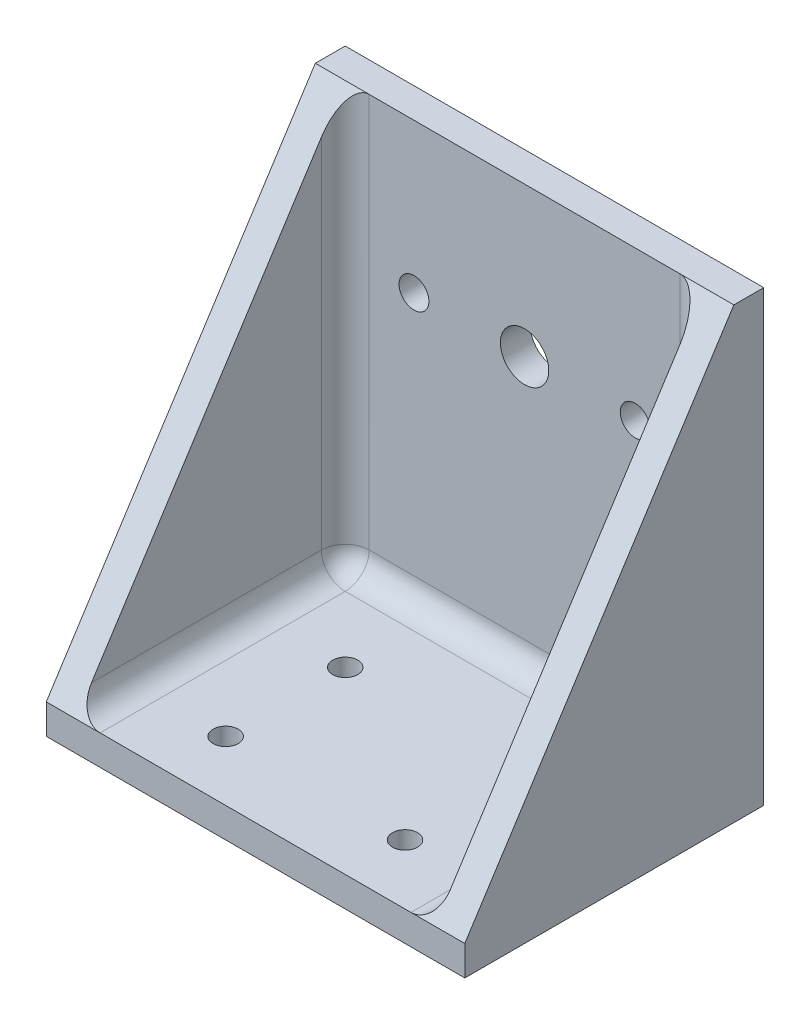
ISO-10303-21;
HEADER;
FILE_DESCRIPTION(('STEP AP214'),'2;1');
FILE_NAME('part.step','',(''),(''),'','','');
FILE_SCHEMA(('AUTOMOTIVE_DESIGN { 1 0 10303 214 1 1 1 1 }'));
ENDSEC;
DATA;
#1=APPLICATION_CONTEXT('core data for automotive mechanical design processes');
#2=APPLICATION_PROTOCOL_DEFINITION('international standard','automotive_design',2000,#1);
#3=PRODUCT_CONTEXT('',#1,'mechanical');
#4=PRODUCT('Part','Part','',(#3));
#5=PRODUCT_RELATED_PRODUCT_CATEGORY('part','',(#4));
#6=PRODUCT_DEFINITION_FORMATION('','',#4);
#7=PRODUCT_DEFINITION_CONTEXT('part definition',#1,'design');
#8=PRODUCT_DEFINITION('design','',#6,#7);
#9=PRODUCT_DEFINITION_SHAPE('','',#8);
#10=(LENGTH_UNIT() NAMED_UNIT(*) SI_UNIT(.MILLI.,.METRE.));
#11=(NAMED_UNIT(*) PLANE_ANGLE_UNIT() SI_UNIT($,.RADIAN.));
#12=(NAMED_UNIT(*) SI_UNIT($,.STERADIAN.) SOLID_ANGLE_UNIT());
#13=UNCERTAINTY_MEASURE_WITH_UNIT(LENGTH_MEASURE(1.E-05),#10,'distance_accuracy_value','');
#14=(GEOMETRIC_REPRESENTATION_CONTEXT(3) GLOBAL_UNCERTAINTY_ASSIGNED_CONTEXT((#13)) GLOBAL_UNIT_ASSIGNED_CONTEXT((#10,
#11,#12)) REPRESENTATION_CONTEXT('',''));
#15=CARTESIAN_POINT('',(0.,0.,0.));
#16=DIRECTION('',(0.,0.,1.));
#17=DIRECTION('',(1.,0.,0.));
#18=AXIS2_PLACEMENT_3D('',#15,#16,#17);
#19=CARTESIAN_POINT('',(0.,5.,0.));
#20=DIRECTION('',(0.,-1.,0.));
#21=DIRECTION('',(0.,0.,-1.));
#22=AXIS2_PLACEMENT_3D('',#19,#20,#21);
#23=PLANE('',#22);
#24=CARTESIAN_POINT('',(-15.,5.,15.));
#25=DIRECTION('',(0.,1.,0.));
#26=DIRECTION('',(0.,0.,1.));
#27=AXIS2_PLACEMENT_3D('',#24,#25,#26);
#28=CIRCLE('',#27,2.1);
#29=CARTESIAN_POINT('',(-15.,5.,17.1));
#30=VERTEX_POINT('',#29);
#31=EDGE_CURVE('E460',#30,#30,#28,.T.);
#32=ORIENTED_EDGE('',*,*,#31,.F.);
#33=EDGE_LOOP('',(#32));
#34=FACE_BOUND('',#33,.T.);
#35=CARTESIAN_POINT('',(15.,5.,15.));
#36=DIRECTION('',(0.,1.,0.));
#37=DIRECTION('',(0.,0.,1.));
#38=AXIS2_PLACEMENT_3D('',#35,#36,#37);
#39=CIRCLE('',#38,2.1);
#40=CARTESIAN_POINT('',(15.,5.,17.1));
#41=VERTEX_POINT('',#40);
#42=EDGE_CURVE('E450',#41,#41,#39,.T.);
#43=ORIENTED_EDGE('',*,*,#42,.F.);
#44=EDGE_LOOP('',(#43));
#45=FACE_BOUND('',#44,.T.);
#46=CARTESIAN_POINT('',(15.,5.,-5.));
#47=DIRECTION('',(0.,1.,0.));
#48=DIRECTION('',(0.,0.,1.));
#49=AXIS2_PLACEMENT_3D('',#46,#47,#48);
#50=CIRCLE('',#49,2.1);
#51=CARTESIAN_POINT('',(15.,5.,-2.9));
#52=VERTEX_POINT('',#51);
#53=EDGE_CURVE('E442',#52,#52,#50,.T.);
#54=ORIENTED_EDGE('',*,*,#53,.F.);
#55=EDGE_LOOP('',(#54));
#56=FACE_BOUND('',#55,.T.);
#57=CARTESIAN_POINT('',(-15.,5.,-5.));
#58=DIRECTION('',(0.,1.,0.));
#59=DIRECTION('',(0.,0.,1.));
#60=AXIS2_PLACEMENT_3D('',#57,#58,#59);
#61=CIRCLE('',#60,2.1);
#62=CARTESIAN_POINT('',(-15.,5.,-2.9));
#63=VERTEX_POINT('',#62);
#64=EDGE_CURVE('E445',#63,#63,#61,.T.);
#65=ORIENTED_EDGE('',*,*,#64,.F.);
#66=EDGE_LOOP('',(#65));
#67=FACE_BOUND('',#66,.T.);
#68=DIRECTION('',(1.,0.,0.));
#69=VECTOR('',#68,1.);
#70=CARTESIAN_POINT('',(-35.,5.,25.));
#71=LINE('',#70,#69);
#72=CARTESIAN_POINT('',(-26.,5.,25.));
#73=VERTEX_POINT('',#72);
#74=CARTESIAN_POINT('',(26.,5.,25.));
#75=VERTEX_POINT('',#74);
#76=EDGE_CURVE('E252',#73,#75,#71,.T.);
#77=ORIENTED_EDGE('',*,*,#76,.T.);
#78=DIRECTION('',(0.,0.,-1.));
#79=VECTOR('',#78,1.);
#80=CARTESIAN_POINT('',(26.,5.,0.));
#81=LINE('',#80,#79);
#82=CARTESIAN_POINT('',(26.,5.,-16.));
#83=VERTEX_POINT('',#82);
#84=EDGE_CURVE('E122',#75,#83,#81,.T.);
#85=ORIENTED_EDGE('',*,*,#84,.T.);
#86=DIRECTION('',(1.,0.,0.));
#87=VECTOR('',#86,1.);
#88=CARTESIAN_POINT('',(-30.,5.,-16.));
#89=LINE('',#88,#87);
#90=CARTESIAN_POINT('',(-26.,5.,-16.));
#91=VERTEX_POINT('',#90);
#92=EDGE_CURVE('E157',#83,#91,#89,.F.);
#93=ORIENTED_EDGE('',*,*,#92,.T.);
#94=DIRECTION('',(0.,0.,1.));
#95=VECTOR('',#94,1.);
#96=CARTESIAN_POINT('',(-26.,5.,25.));
#97=LINE('',#96,#95);
#98=EDGE_CURVE('E160',#91,#73,#97,.T.);
#99=ORIENTED_EDGE('',*,*,#98,.T.);
#100=EDGE_LOOP('',(#77,#85,#93,#99));
#101=FACE_BOUND('',#100,.T.);
#102=ADVANCED_FACE('F43',(#34,#45,#56,#67,#101),#23,.F.);
#103=CARTESIAN_POINT('',(-35.,75.,-20.));
#104=DIRECTION('',(0.,0.,-1.));
#105=DIRECTION('',(-1.,0.,0.));
#106=AXIS2_PLACEMENT_3D('',#103,#104,#105);
#107=PLANE('',#106);
#108=CARTESIAN_POINT('',(0.,50.,-20.));
#109=DIRECTION('',(0.,0.,-1.));
#110=DIRECTION('',(-1.,0.,0.));
#111=AXIS2_PLACEMENT_3D('',#108,#109,#110);
#112=CIRCLE('',#111,4.05);
#113=CARTESIAN_POINT('',(-4.05,50.,-20.));
#114=VERTEX_POINT('',#113);
#115=EDGE_CURVE('E232',#114,#114,#112,.T.);
#116=ORIENTED_EDGE('',*,*,#115,.T.);
#117=EDGE_LOOP('',(#116));
#118=FACE_BOUND('',#117,.T.);
#119=CARTESIAN_POINT('',(18.5,50.,-20.));
#120=DIRECTION('',(0.,0.,-1.));
#121=DIRECTION('',(-1.,0.,0.));
#122=AXIS2_PLACEMENT_3D('',#119,#120,#121);
#123=CIRCLE('',#122,2.5);
#124=CARTESIAN_POINT('',(16.,50.,-20.));
#125=VERTEX_POINT('',#124);
#126=EDGE_CURVE('E224',#125,#125,#123,.T.);
#127=ORIENTED_EDGE('',*,*,#126,.T.);
#128=EDGE_LOOP('',(#127));
#129=FACE_BOUND('',#128,.T.);
#130=CARTESIAN_POINT('',(-18.5,50.,-20.));
#131=DIRECTION('',(0.,0.,-1.));
#132=DIRECTION('',(-1.,0.,0.));
#133=AXIS2_PLACEMENT_3D('',#130,#131,#132);
#134=CIRCLE('',#133,2.5);
#135=CARTESIAN_POINT('',(-21.,50.,-20.));
#136=VERTEX_POINT('',#135);
#137=EDGE_CURVE('E233',#136,#136,#134,.T.);
#138=ORIENTED_EDGE('',*,*,#137,.T.);
#139=EDGE_LOOP('',(#138));
#140=FACE_BOUND('',#139,.T.);
#141=DIRECTION('',(1.,0.,0.));
#142=VECTOR('',#141,1.);
#143=CARTESIAN_POINT('',(30.,9.00000000000001,-20.));
#144=LINE('',#143,#142);
#145=CARTESIAN_POINT('',(-26.,9.00000000000001,-20.));
#146=VERTEX_POINT('',#145);
#147=CARTESIAN_POINT('',(26.,9.00000000000001,-20.));
#148=VERTEX_POINT('',#147);
#149=EDGE_CURVE('E142',#146,#148,#144,.T.);
#150=ORIENTED_EDGE('',*,*,#149,.T.);
#151=DIRECTION('',(0.,1.,0.));
#152=VECTOR('',#151,1.);
#153=CARTESIAN_POINT('',(26.,75.,-20.));
#154=LINE('',#153,#152);
#155=CARTESIAN_POINT('',(26.,75.,-20.));
#156=VERTEX_POINT('',#155);
#157=EDGE_CURVE('E141',#148,#156,#154,.T.);
#158=ORIENTED_EDGE('',*,*,#157,.T.);
#159=DIRECTION('',(1.,0.,0.));
#160=VECTOR('',#159,1.);
#161=CARTESIAN_POINT('',(-35.,75.,-20.));
#162=LINE('',#161,#160);
#163=CARTESIAN_POINT('',(-26.,75.,-20.));
#164=VERTEX_POINT('',#163);
#165=EDGE_CURVE('E237',#164,#156,#162,.T.);
#166=ORIENTED_EDGE('',*,*,#165,.F.);
#167=DIRECTION('',(0.,-1.,0.));
#168=VECTOR('',#167,1.);
#169=CARTESIAN_POINT('',(-26.,5.,-20.));
#170=LINE('',#169,#168);
#171=EDGE_CURVE('E133',#164,#146,#170,.T.);
#172=ORIENTED_EDGE('',*,*,#171,.T.);
#173=EDGE_LOOP('',(#150,#158,#166,#172));
#174=FACE_BOUND('',#173,.T.);
#175=ADVANCED_FACE('F291',(#118,#129,#140,#174),#107,.F.);
#176=CARTESIAN_POINT('',(35.,5.,25.));
#177=DIRECTION('',(-1.,0.,0.));
#178=DIRECTION('',(0.,0.,1.));
#179=AXIS2_PLACEMENT_3D('',#176,#177,#178);
#180=PLANE('',#179);
#181=DIRECTION('',(0.,0.,-1.));
#182=VECTOR('',#181,1.);
#183=CARTESIAN_POINT('',(35.,0.,25.));
#184=LINE('',#183,#182);
#185=CARTESIAN_POINT('',(35.,0.,25.));
#186=VERTEX_POINT('',#185);
#187=CARTESIAN_POINT('',(35.,0.,-25.));
#188=VERTEX_POINT('',#187);
#189=EDGE_CURVE('E248',#186,#188,#184,.T.);
#190=ORIENTED_EDGE('',*,*,#189,.T.);
#191=DIRECTION('',(0.,-1.,0.));
#192=VECTOR('',#191,1.);
#193=CARTESIAN_POINT('',(35.,5.,-25.));
#194=LINE('',#193,#192);
#195=CARTESIAN_POINT('',(35.,75.,-25.));
#196=VERTEX_POINT('',#195);
#197=EDGE_CURVE('E149',#196,#188,#194,.T.);
#198=ORIENTED_EDGE('',*,*,#197,.F.);
#199=DIRECTION('',(0.,0.,-1.));
#200=VECTOR('',#199,1.);
#201=CARTESIAN_POINT('',(35.,75.,-25.));
#202=LINE('',#201,#200);
#203=CARTESIAN_POINT('',(35.,75.,-20.));
#204=VERTEX_POINT('',#203);
#205=EDGE_CURVE('E240',#204,#196,#202,.T.);
#206=ORIENTED_EDGE('',*,*,#205,.F.);
#207=DIRECTION('',(0.,-0.841178475376554,0.540757591313499));
#208=VECTOR('',#207,1.);
#209=CARTESIAN_POINT('',(35.,75.,-20.));
#210=LINE('',#209,#208);
#211=CARTESIAN_POINT('',(35.,5.,25.));
#212=VERTEX_POINT('',#211);
#213=EDGE_CURVE('E128',#204,#212,#210,.T.);
#214=ORIENTED_EDGE('',*,*,#213,.T.);
#215=DIRECTION('',(0.,-1.,0.));
#216=VECTOR('',#215,1.);
#217=CARTESIAN_POINT('',(35.,5.,25.));
#218=LINE('',#217,#216);
#219=EDGE_CURVE('E251',#212,#186,#218,.T.);
#220=ORIENTED_EDGE('',*,*,#219,.T.);
#221=EDGE_LOOP('',(#190,#198,#206,#214,#220));
#222=FACE_BOUND('',#221,.T.);
#223=ADVANCED_FACE('F315',(#222),#180,.F.);
#224=CARTESIAN_POINT('',(-35.,5.,-25.));
#225=DIRECTION('',(0.,0.,1.));
#226=DIRECTION('',(1.,0.,0.));
#227=AXIS2_PLACEMENT_3D('',#224,#225,#226);
#228=PLANE('',#227);
#229=CARTESIAN_POINT('',(-18.5,50.,-25.));
#230=DIRECTION('',(0.,0.,-1.));
#231=DIRECTION('',(-1.,0.,0.));
#232=AXIS2_PLACEMENT_3D('',#229,#230,#231);
#233=CIRCLE('',#232,2.5);
#234=CARTESIAN_POINT('',(-21.,50.,-25.));
#235=VERTEX_POINT('',#234);
#236=EDGE_CURVE('E220',#235,#235,#233,.T.);
#237=ORIENTED_EDGE('',*,*,#236,.F.);
#238=EDGE_LOOP('',(#237));
#239=FACE_BOUND('',#238,.T.);
#240=CARTESIAN_POINT('',(18.5,50.,-25.));
#241=DIRECTION('',(0.,0.,-1.));
#242=DIRECTION('',(-1.,0.,0.));
#243=AXIS2_PLACEMENT_3D('',#240,#241,#242);
#244=CIRCLE('',#243,2.5);
#245=CARTESIAN_POINT('',(16.,50.,-25.));
#246=VERTEX_POINT('',#245);
#247=EDGE_CURVE('E216',#246,#246,#244,.T.);
#248=ORIENTED_EDGE('',*,*,#247,.F.);
#249=EDGE_LOOP('',(#248));
#250=FACE_BOUND('',#249,.T.);
#251=CARTESIAN_POINT('',(0.,50.,-25.));
#252=DIRECTION('',(0.,0.,-1.));
#253=DIRECTION('',(-1.,0.,0.));
#254=AXIS2_PLACEMENT_3D('',#251,#252,#253);
#255=CIRCLE('',#254,4.05);
#256=CARTESIAN_POINT('',(-4.05,50.,-25.));
#257=VERTEX_POINT('',#256);
#258=EDGE_CURVE('E228',#257,#257,#255,.T.);
#259=ORIENTED_EDGE('',*,*,#258,.F.);
#260=EDGE_LOOP('',(#259));
#261=FACE_BOUND('',#260,.T.);
#262=DIRECTION('',(-1.,0.,0.));
#263=VECTOR('',#262,1.);
#264=CARTESIAN_POINT('',(-35.,0.,-25.));
#265=LINE('',#264,#263);
#266=CARTESIAN_POINT('',(-35.,0.,-25.));
#267=VERTEX_POINT('',#266);
#268=EDGE_CURVE('E256',#188,#267,#265,.T.);
#269=ORIENTED_EDGE('',*,*,#268,.T.);
#270=DIRECTION('',(0.,-1.,0.));
#271=VECTOR('',#270,1.);
#272=CARTESIAN_POINT('',(-35.,5.,-25.));
#273=LINE('',#272,#271);
#274=CARTESIAN_POINT('',(-35.,75.,-25.));
#275=VERTEX_POINT('',#274);
#276=EDGE_CURVE('E275',#275,#267,#273,.T.);
#277=ORIENTED_EDGE('',*,*,#276,.F.);
#278=DIRECTION('',(-1.,0.,0.));
#279=VECTOR('',#278,1.);
#280=CARTESIAN_POINT('',(-35.,75.,-25.));
#281=LINE('',#280,#279);
#282=EDGE_CURVE('E244',#196,#275,#281,.T.);
#283=ORIENTED_EDGE('',*,*,#282,.F.);
#284=ORIENTED_EDGE('',*,*,#197,.T.);
#285=EDGE_LOOP('',(#269,#277,#283,#284));
#286=FACE_BOUND('',#285,.T.);
#287=ADVANCED_FACE('F333',(#239,#250,#261,#286),#228,.F.);
#288=CARTESIAN_POINT('',(-35.,5.,25.));
#289=DIRECTION('',(1.,0.,0.));
#290=DIRECTION('',(0.,0.,-1.));
#291=AXIS2_PLACEMENT_3D('',#288,#289,#290);
#292=PLANE('',#291);
#293=DIRECTION('',(0.,-1.,0.));
#294=VECTOR('',#293,1.);
#295=CARTESIAN_POINT('',(-35.,5.,25.));
#296=LINE('',#295,#294);
#297=CARTESIAN_POINT('',(-35.,5.,25.));
#298=VERTEX_POINT('',#297);
#299=CARTESIAN_POINT('',(-35.,0.,25.));
#300=VERTEX_POINT('',#299);
#301=EDGE_CURVE('E271',#298,#300,#296,.T.);
#302=ORIENTED_EDGE('',*,*,#301,.F.);
#303=DIRECTION('',(0.,0.841178475376554,-0.540757591313499));
#304=VECTOR('',#303,1.);
#305=CARTESIAN_POINT('',(-35.,75.,-20.));
#306=LINE('',#305,#304);
#307=CARTESIAN_POINT('',(-35.,75.,-20.));
#308=VERTEX_POINT('',#307);
#309=EDGE_CURVE('E129',#298,#308,#306,.T.);
#310=ORIENTED_EDGE('',*,*,#309,.T.);
#311=DIRECTION('',(0.,0.,1.));
#312=VECTOR('',#311,1.);
#313=CARTESIAN_POINT('',(-35.,75.,-25.));
#314=LINE('',#313,#312);
#315=EDGE_CURVE('E234',#275,#308,#314,.T.);
#316=ORIENTED_EDGE('',*,*,#315,.F.);
#317=ORIENTED_EDGE('',*,*,#276,.T.);
#318=DIRECTION('',(0.,0.,1.));
#319=VECTOR('',#318,1.);
#320=CARTESIAN_POINT('',(-35.,0.,25.));
#321=LINE('',#320,#319);
#322=EDGE_CURVE('E260',#267,#300,#321,.T.);
#323=ORIENTED_EDGE('',*,*,#322,.T.);
#324=EDGE_LOOP('',(#302,#310,#316,#317,#323));
#325=FACE_BOUND('',#324,.T.);
#326=ADVANCED_FACE('F330',(#325),#292,.F.);
#327=CARTESIAN_POINT('',(-35.,5.,25.));
#328=DIRECTION('',(0.,0.,-1.));
#329=DIRECTION('',(-1.,0.,0.));
#330=AXIS2_PLACEMENT_3D('',#327,#328,#329);
#331=PLANE('',#330);
#332=DIRECTION('',(1.,0.,0.));
#333=VECTOR('',#332,1.);
#334=CARTESIAN_POINT('',(-35.,0.,25.));
#335=LINE('',#334,#333);
#336=EDGE_CURVE('E264',#300,#186,#335,.T.);
#337=ORIENTED_EDGE('',*,*,#336,.T.);
#338=ORIENTED_EDGE('',*,*,#219,.F.);
#339=DIRECTION('',(1.,0.,0.));
#340=VECTOR('',#339,1.);
#341=CARTESIAN_POINT('',(30.,5.,25.));
#342=LINE('',#341,#340);
#343=EDGE_CURVE('E70',#75,#212,#342,.T.);
#344=ORIENTED_EDGE('',*,*,#343,.F.);
#345=ORIENTED_EDGE('',*,*,#76,.F.);
#346=EDGE_CURVE('E85',#298,#73,#71,.T.);
#347=ORIENTED_EDGE('',*,*,#346,.F.);
#348=ORIENTED_EDGE('',*,*,#301,.T.);
#349=EDGE_LOOP('',(#337,#338,#344,#345,#347,#348));
#350=FACE_BOUND('',#349,.T.);
#351=ADVANCED_FACE('F326',(#350),#331,.F.);
#352=CARTESIAN_POINT('',(0.,0.,0.));
#353=DIRECTION('',(0.,-1.,0.));
#354=DIRECTION('',(0.,0.,-1.));
#355=AXIS2_PLACEMENT_3D('',#352,#353,#354);
#356=PLANE('',#355);
#357=CARTESIAN_POINT('',(-15.,0.,15.));
#358=DIRECTION('',(0.,1.,0.));
#359=DIRECTION('',(0.,0.,1.));
#360=AXIS2_PLACEMENT_3D('',#357,#358,#359);
#361=CIRCLE('',#360,2.1);
#362=CARTESIAN_POINT('',(-15.,0.,17.1));
#363=VERTEX_POINT('',#362);
#364=EDGE_CURVE('E464',#363,#363,#361,.T.);
#365=ORIENTED_EDGE('',*,*,#364,.T.);
#366=EDGE_LOOP('',(#365));
#367=FACE_BOUND('',#366,.T.);
#368=CARTESIAN_POINT('',(15.,0.,15.));
#369=DIRECTION('',(0.,1.,0.));
#370=DIRECTION('',(0.,0.,1.));
#371=AXIS2_PLACEMENT_3D('',#368,#369,#370);
#372=CIRCLE('',#371,2.1);
#373=CARTESIAN_POINT('',(15.,0.,17.1));
#374=VERTEX_POINT('',#373);
#375=EDGE_CURVE('E456',#374,#374,#372,.T.);
#376=ORIENTED_EDGE('',*,*,#375,.T.);
#377=EDGE_LOOP('',(#376));
#378=FACE_BOUND('',#377,.T.);
#379=CARTESIAN_POINT('',(15.,0.,-5.));
#380=DIRECTION('',(0.,1.,0.));
#381=DIRECTION('',(0.,0.,1.));
#382=AXIS2_PLACEMENT_3D('',#379,#380,#381);
#383=CIRCLE('',#382,2.1);
#384=CARTESIAN_POINT('',(15.,0.,-2.9));
#385=VERTEX_POINT('',#384);
#386=EDGE_CURVE('E439',#385,#385,#383,.T.);
#387=ORIENTED_EDGE('',*,*,#386,.T.);
#388=EDGE_LOOP('',(#387));
#389=FACE_BOUND('',#388,.T.);
#390=CARTESIAN_POINT('',(-15.,0.,-5.));
#391=DIRECTION('',(0.,1.,0.));
#392=DIRECTION('',(0.,0.,1.));
#393=AXIS2_PLACEMENT_3D('',#390,#391,#392);
#394=CIRCLE('',#393,2.1);
#395=CARTESIAN_POINT('',(-15.,0.,-2.9));
#396=VERTEX_POINT('',#395);
#397=EDGE_CURVE('E182',#396,#396,#394,.T.);
#398=ORIENTED_EDGE('',*,*,#397,.T.);
#399=EDGE_LOOP('',(#398));
#400=FACE_BOUND('',#399,.T.);
#401=ORIENTED_EDGE('',*,*,#189,.F.);
#402=ORIENTED_EDGE('',*,*,#336,.F.);
#403=ORIENTED_EDGE('',*,*,#322,.F.);
#404=ORIENTED_EDGE('',*,*,#268,.F.);
#405=EDGE_LOOP('',(#401,#402,#403,#404));
#406=FACE_BOUND('',#405,.T.);
#407=ADVANCED_FACE('F322',(#367,#378,#389,#400,#406),#356,.T.);
#408=CARTESIAN_POINT('',(0.,75.,0.));
#409=DIRECTION('',(0.,1.,0.));
#410=DIRECTION('',(0.,0.,1.));
#411=AXIS2_PLACEMENT_3D('',#408,#409,#410);
#412=PLANE('',#411);
#413=ORIENTED_EDGE('',*,*,#315,.T.);
#414=EDGE_CURVE('E61',#308,#164,#162,.T.);
#415=ORIENTED_EDGE('',*,*,#414,.T.);
#416=ORIENTED_EDGE('',*,*,#165,.T.);
#417=DIRECTION('',(1.,0.,0.));
#418=VECTOR('',#417,1.);
#419=CARTESIAN_POINT('',(30.,75.,-20.));
#420=LINE('',#419,#418);
#421=EDGE_CURVE('E210',#156,#204,#420,.T.);
#422=ORIENTED_EDGE('',*,*,#421,.T.);
#423=ORIENTED_EDGE('',*,*,#205,.T.);
#424=ORIENTED_EDGE('',*,*,#282,.T.);
#425=EDGE_LOOP('',(#413,#415,#416,#422,#423,#424));
#426=FACE_BOUND('',#425,.T.);
#427=ADVANCED_FACE('F325',(#426),#412,.T.);
#428=CARTESIAN_POINT('',(0.,50.,-15.));
#429=DIRECTION('',(0.,0.,-1.));
#430=DIRECTION('',(-1.,0.,0.));
#431=AXIS2_PLACEMENT_3D('',#428,#429,#430);
#432=CYLINDRICAL_SURFACE('',#431,4.05);
#433=ORIENTED_EDGE('',*,*,#258,.T.);
#434=EDGE_LOOP('',(#433));
#435=FACE_BOUND('',#434,.T.);
#436=ORIENTED_EDGE('',*,*,#115,.F.);
#437=EDGE_LOOP('',(#436));
#438=FACE_BOUND('',#437,.T.);
#439=ADVANCED_FACE('F306',(#435,#438),#432,.F.);
#440=CARTESIAN_POINT('',(18.5,50.,-15.));
#441=DIRECTION('',(0.,0.,-1.));
#442=DIRECTION('',(-1.,0.,0.));
#443=AXIS2_PLACEMENT_3D('',#440,#441,#442);
#444=CYLINDRICAL_SURFACE('',#443,2.5);
#445=ORIENTED_EDGE('',*,*,#247,.T.);
#446=EDGE_LOOP('',(#445));
#447=FACE_BOUND('',#446,.T.);
#448=ORIENTED_EDGE('',*,*,#126,.F.);
#449=EDGE_LOOP('',(#448));
#450=FACE_BOUND('',#449,.T.);
#451=ADVANCED_FACE('F296',(#447,#450),#444,.F.);
#452=CARTESIAN_POINT('',(-18.5,50.,-15.));
#453=DIRECTION('',(0.,0.,-1.));
#454=DIRECTION('',(-1.,0.,0.));
#455=AXIS2_PLACEMENT_3D('',#452,#453,#454);
#456=CYLINDRICAL_SURFACE('',#455,2.5);
#457=ORIENTED_EDGE('',*,*,#236,.T.);
#458=EDGE_LOOP('',(#457));
#459=FACE_BOUND('',#458,.T.);
#460=ORIENTED_EDGE('',*,*,#137,.F.);
#461=EDGE_LOOP('',(#460));
#462=FACE_BOUND('',#461,.T.);
#463=ADVANCED_FACE('F293',(#459,#462),#456,.F.);
#464=CARTESIAN_POINT('',(30.,75.,-20.));
#465=DIRECTION('',(0.,0.540757591313499,0.841178475376554));
#466=DIRECTION('',(0.,-0.841178475376554,0.540757591313499));
#467=AXIS2_PLACEMENT_3D('',#464,#465,#466);
#468=PLANE('',#467);
#469=ORIENTED_EDGE('',*,*,#213,.F.);
#470=ORIENTED_EDGE('',*,*,#421,.F.);
#471=CARTESIAN_POINT('',(26.,68.7777777777778,-16.));
#472=DIRECTION('',(0.,0.540757591313499,0.841178475376554));
#473=DIRECTION('',(0.,0.841178475376554,-0.540757591313499));
#474=AXIS2_PLACEMENT_3D('',#471,#472,#473);
#475=ELLIPSE('',#474,7.397029767597,4.);
#476=CARTESIAN_POINT('',(30.,68.7777777777778,-16.));
#477=VERTEX_POINT('',#476);
#478=EDGE_CURVE('E167',#156,#477,#475,.F.);
#479=ORIENTED_EDGE('',*,*,#478,.T.);
#480=DIRECTION('',(0.,-0.841178475376554,0.540757591313499));
#481=VECTOR('',#480,1.);
#482=CARTESIAN_POINT('',(30.,75.,-20.));
#483=LINE('',#482,#481);
#484=CARTESIAN_POINT('',(30.,9.00000000000001,22.4285714285714));
#485=VERTEX_POINT('',#484);
#486=EDGE_CURVE('E206',#477,#485,#483,.T.);
#487=ORIENTED_EDGE('',*,*,#486,.T.);
#488=CARTESIAN_POINT('',(26.,9.,22.4285714285714));
#489=DIRECTION('',(0.,0.540757591313499,0.841178475376554));
#490=DIRECTION('',(0.,0.841178475376554,-0.540757591313499));
#491=AXIS2_PLACEMENT_3D('',#488,#489,#490);
#492=ELLIPSE('',#491,4.75523342202664,4.);
#493=EDGE_CURVE('E171',#485,#75,#492,.F.);
#494=ORIENTED_EDGE('',*,*,#493,.T.);
#495=ORIENTED_EDGE('',*,*,#343,.T.);
#496=EDGE_LOOP('',(#469,#470,#479,#487,#494,#495));
#497=FACE_BOUND('',#496,.T.);
#498=ADVANCED_FACE('F295',(#497),#468,.T.);
#499=CARTESIAN_POINT('',(30.,0.,0.));
#500=DIRECTION('',(-1.,0.,0.));
#501=DIRECTION('',(0.,0.,1.));
#502=AXIS2_PLACEMENT_3D('',#499,#500,#501);
#503=PLANE('',#502);
#504=ORIENTED_EDGE('',*,*,#486,.F.);
#505=DIRECTION('',(0.,1.,0.));
#506=VECTOR('',#505,1.);
#507=CARTESIAN_POINT('',(30.,0.,-16.));
#508=LINE('',#507,#506);
#509=CARTESIAN_POINT('',(30.,9.,-16.));
#510=VERTEX_POINT('',#509);
#511=EDGE_CURVE('E97',#477,#510,#508,.F.);
#512=ORIENTED_EDGE('',*,*,#511,.T.);
#513=DIRECTION('',(0.,0.,-1.));
#514=VECTOR('',#513,1.);
#515=CARTESIAN_POINT('',(30.,9.,0.));
#516=LINE('',#515,#514);
#517=EDGE_CURVE('E147',#510,#485,#516,.F.);
#518=ORIENTED_EDGE('',*,*,#517,.T.);
#519=EDGE_LOOP('',(#504,#512,#518));
#520=FACE_BOUND('',#519,.T.);
#521=ADVANCED_FACE('F303',(#520),#503,.T.);
#522=CARTESIAN_POINT('',(-30.,75.,-20.));
#523=DIRECTION('',(0.,0.540757591313499,0.841178475376554));
#524=DIRECTION('',(0.,-0.841178475376554,0.540757591313499));
#525=AXIS2_PLACEMENT_3D('',#522,#523,#524);
#526=PLANE('',#525);
#527=ORIENTED_EDGE('',*,*,#309,.F.);
#528=ORIENTED_EDGE('',*,*,#346,.T.);
#529=CARTESIAN_POINT('',(-26.,9.,22.4285714285714));
#530=DIRECTION('',(0.,0.540757591313499,0.841178475376554));
#531=DIRECTION('',(0.,0.841178475376554,-0.540757591313499));
#532=AXIS2_PLACEMENT_3D('',#529,#530,#531);
#533=ELLIPSE('',#532,4.75523342202664,4.);
#534=CARTESIAN_POINT('',(-30.,9.00000000000001,22.4285714285714));
#535=VERTEX_POINT('',#534);
#536=EDGE_CURVE('E53',#73,#535,#533,.F.);
#537=ORIENTED_EDGE('',*,*,#536,.T.);
#538=DIRECTION('',(0.,0.841178475376554,-0.540757591313499));
#539=VECTOR('',#538,1.);
#540=CARTESIAN_POINT('',(-30.,75.,-20.));
#541=LINE('',#540,#539);
#542=CARTESIAN_POINT('',(-30.,68.7777777777778,-16.));
#543=VERTEX_POINT('',#542);
#544=EDGE_CURVE('E114',#535,#543,#541,.T.);
#545=ORIENTED_EDGE('',*,*,#544,.T.);
#546=CARTESIAN_POINT('',(-26.,68.7777777777778,-16.));
#547=DIRECTION('',(0.,0.540757591313499,0.841178475376554));
#548=DIRECTION('',(0.,0.841178475376554,-0.540757591313499));
#549=AXIS2_PLACEMENT_3D('',#546,#547,#548);
#550=ELLIPSE('',#549,7.397029767597,4.);
#551=EDGE_CURVE('E11',#543,#164,#550,.F.);
#552=ORIENTED_EDGE('',*,*,#551,.T.);
#553=ORIENTED_EDGE('',*,*,#414,.F.);
#554=EDGE_LOOP('',(#527,#528,#537,#545,#552,#553));
#555=FACE_BOUND('',#554,.T.);
#556=ADVANCED_FACE('F124',(#555),#526,.T.);
#557=CARTESIAN_POINT('',(-30.,0.,0.));
#558=DIRECTION('',(-1.,0.,0.));
#559=DIRECTION('',(0.,0.,1.));
#560=AXIS2_PLACEMENT_3D('',#557,#558,#559);
#561=PLANE('',#560);
#562=ORIENTED_EDGE('',*,*,#544,.F.);
#563=DIRECTION('',(0.,0.,1.));
#564=VECTOR('',#563,1.);
#565=CARTESIAN_POINT('',(-30.,9.,-20.));
#566=LINE('',#565,#564);
#567=CARTESIAN_POINT('',(-30.,9.,-16.));
#568=VERTEX_POINT('',#567);
#569=EDGE_CURVE('E116',#535,#568,#566,.F.);
#570=ORIENTED_EDGE('',*,*,#569,.T.);
#571=DIRECTION('',(0.,-1.,0.));
#572=VECTOR('',#571,1.);
#573=CARTESIAN_POINT('',(-30.,75.,-16.));
#574=LINE('',#573,#572);
#575=EDGE_CURVE('E111',#568,#543,#574,.F.);
#576=ORIENTED_EDGE('',*,*,#575,.T.);
#577=EDGE_LOOP('',(#562,#570,#576));
#578=FACE_BOUND('',#577,.T.);
#579=ADVANCED_FACE('F113',(#578),#561,.F.);
#580=CARTESIAN_POINT('',(-26.,9.,0.));
#581=DIRECTION('',(0.,0.,-1.));
#582=DIRECTION('',(-1.,0.,0.));
#583=AXIS2_PLACEMENT_3D('',#580,#581,#582);
#584=CYLINDRICAL_SURFACE('',#583,4.);
#585=ORIENTED_EDGE('',*,*,#536,.F.);
#586=ORIENTED_EDGE('',*,*,#98,.F.);
#587=CARTESIAN_POINT('',(-26.,9.,-16.));
#588=DIRECTION('',(0.,0.,1.));
#589=DIRECTION('',(1.,0.,0.));
#590=AXIS2_PLACEMENT_3D('',#587,#588,#589);
#591=CIRCLE('',#590,4.);
#592=EDGE_CURVE('E47',#568,#91,#591,.T.);
#593=ORIENTED_EDGE('',*,*,#592,.F.);
#594=ORIENTED_EDGE('',*,*,#569,.F.);
#595=EDGE_LOOP('',(#585,#586,#593,#594));
#596=FACE_BOUND('',#595,.T.);
#597=ADVANCED_FACE('F45',(#596),#584,.F.);
#598=CARTESIAN_POINT('',(-26.,75.,-16.));
#599=DIRECTION('',(0.,1.,0.));
#600=DIRECTION('',(0.,0.,1.));
#601=AXIS2_PLACEMENT_3D('',#598,#599,#600);
#602=CYLINDRICAL_SURFACE('',#601,4.);
#603=ORIENTED_EDGE('',*,*,#551,.F.);
#604=ORIENTED_EDGE('',*,*,#575,.F.);
#605=CARTESIAN_POINT('',(-26.,9.00000000000001,-16.));
#606=DIRECTION('',(0.,1.,0.));
#607=DIRECTION('',(-1.,0.,0.));
#608=AXIS2_PLACEMENT_3D('',#605,#606,#607);
#609=CIRCLE('',#608,4.);
#610=EDGE_CURVE('E136',#146,#568,#609,.T.);
#611=ORIENTED_EDGE('',*,*,#610,.F.);
#612=ORIENTED_EDGE('',*,*,#171,.F.);
#613=EDGE_LOOP('',(#603,#604,#611,#612));
#614=FACE_BOUND('',#613,.T.);
#615=ADVANCED_FACE('F131',(#614),#602,.F.);
#616=CARTESIAN_POINT('',(-26.,9.,-16.));
#617=DIRECTION('',(-1.,0.,0.));
#618=DIRECTION('',(0.,0.,1.));
#619=AXIS2_PLACEMENT_3D('',#616,#617,#618);
#620=SPHERICAL_SURFACE('',#619,4.);
#621=ORIENTED_EDGE('',*,*,#610,.T.);
#622=ORIENTED_EDGE('',*,*,#592,.T.);
#623=CARTESIAN_POINT('',(-26.,9.,-16.));
#624=DIRECTION('',(1.,0.,0.));
#625=DIRECTION('',(0.,0.,-1.));
#626=AXIS2_PLACEMENT_3D('',#623,#624,#625);
#627=CIRCLE('',#626,4.);
#628=EDGE_CURVE('E190',#146,#91,#627,.F.);
#629=ORIENTED_EDGE('',*,*,#628,.F.);
#630=EDGE_LOOP('',(#621,#622,#629));
#631=FACE_BOUND('',#630,.T.);
#632=ADVANCED_FACE('F356',(#631),#620,.F.);
#633=CARTESIAN_POINT('',(26.,9.,0.));
#634=DIRECTION('',(0.,0.,-1.));
#635=DIRECTION('',(-1.,0.,0.));
#636=AXIS2_PLACEMENT_3D('',#633,#634,#635);
#637=CYLINDRICAL_SURFACE('',#636,4.);
#638=ORIENTED_EDGE('',*,*,#493,.F.);
#639=ORIENTED_EDGE('',*,*,#517,.F.);
#640=CARTESIAN_POINT('',(26.,9.,-16.));
#641=DIRECTION('',(0.,0.,1.));
#642=DIRECTION('',(1.,0.,0.));
#643=AXIS2_PLACEMENT_3D('',#640,#641,#642);
#644=CIRCLE('',#643,4.);
#645=EDGE_CURVE('E186',#83,#510,#644,.T.);
#646=ORIENTED_EDGE('',*,*,#645,.F.);
#647=ORIENTED_EDGE('',*,*,#84,.F.);
#648=EDGE_LOOP('',(#638,#639,#646,#647));
#649=FACE_BOUND('',#648,.T.);
#650=ADVANCED_FACE('F352',(#649),#637,.F.);
#651=CARTESIAN_POINT('',(-35.,9.00000000000001,-16.));
#652=DIRECTION('',(-1.,0.,0.));
#653=DIRECTION('',(0.,0.,1.));
#654=AXIS2_PLACEMENT_3D('',#651,#652,#653);
#655=CYLINDRICAL_SURFACE('',#654,4.);
#656=ORIENTED_EDGE('',*,*,#628,.T.);
#657=ORIENTED_EDGE('',*,*,#92,.F.);
#658=CARTESIAN_POINT('',(26.,9.00000000000001,-16.));
#659=DIRECTION('',(-1.,0.,0.));
#660=DIRECTION('',(0.,0.,1.));
#661=AXIS2_PLACEMENT_3D('',#658,#659,#660);
#662=CIRCLE('',#661,4.);
#663=EDGE_CURVE('E181',#148,#83,#662,.T.);
#664=ORIENTED_EDGE('',*,*,#663,.F.);
#665=ORIENTED_EDGE('',*,*,#149,.F.);
#666=EDGE_LOOP('',(#656,#657,#664,#665));
#667=FACE_BOUND('',#666,.T.);
#668=ADVANCED_FACE('F348',(#667),#655,.F.);
#669=CARTESIAN_POINT('',(26.,9.,-16.));
#670=DIRECTION('',(0.,-1.,0.));
#671=DIRECTION('',(0.,0.,-1.));
#672=AXIS2_PLACEMENT_3D('',#669,#670,#671);
#673=SPHERICAL_SURFACE('',#672,4.);
#674=ORIENTED_EDGE('',*,*,#663,.T.);
#675=ORIENTED_EDGE('',*,*,#645,.T.);
#676=CARTESIAN_POINT('',(26.,9.,-16.));
#677=DIRECTION('',(0.,1.,0.));
#678=DIRECTION('',(0.,0.,1.));
#679=AXIS2_PLACEMENT_3D('',#676,#677,#678);
#680=CIRCLE('',#679,4.);
#681=EDGE_CURVE('E177',#148,#510,#680,.F.);
#682=ORIENTED_EDGE('',*,*,#681,.F.);
#683=EDGE_LOOP('',(#674,#675,#682));
#684=FACE_BOUND('',#683,.T.);
#685=ADVANCED_FACE('F344',(#684),#673,.F.);
#686=CARTESIAN_POINT('',(26.,75.,-16.));
#687=DIRECTION('',(0.,1.,0.));
#688=DIRECTION('',(0.,0.,1.));
#689=AXIS2_PLACEMENT_3D('',#686,#687,#688);
#690=CYLINDRICAL_SURFACE('',#689,4.);
#691=ORIENTED_EDGE('',*,*,#681,.T.);
#692=ORIENTED_EDGE('',*,*,#511,.F.);
#693=ORIENTED_EDGE('',*,*,#478,.F.);
#694=ORIENTED_EDGE('',*,*,#157,.F.);
#695=EDGE_LOOP('',(#691,#692,#693,#694));
#696=FACE_BOUND('',#695,.T.);
#697=ADVANCED_FACE('F340',(#696),#690,.F.);
#698=CARTESIAN_POINT('',(-15.,0.,-5.));
#699=DIRECTION('',(0.,1.,0.));
#700=DIRECTION('',(0.,0.,1.));
#701=AXIS2_PLACEMENT_3D('',#698,#699,#700);
#702=CYLINDRICAL_SURFACE('',#701,2.1);
#703=ORIENTED_EDGE('',*,*,#397,.F.);
#704=EDGE_LOOP('',(#703));
#705=FACE_BOUND('',#704,.T.);
#706=ORIENTED_EDGE('',*,*,#64,.T.);
#707=EDGE_LOOP('',(#706));
#708=FACE_BOUND('',#707,.T.);
#709=ADVANCED_FACE('F343',(#705,#708),#702,.F.);
#710=CARTESIAN_POINT('',(15.,0.,-5.));
#711=DIRECTION('',(0.,1.,0.));
#712=DIRECTION('',(0.,0.,1.));
#713=AXIS2_PLACEMENT_3D('',#710,#711,#712);
#714=CYLINDRICAL_SURFACE('',#713,2.1);
#715=ORIENTED_EDGE('',*,*,#386,.F.);
#716=EDGE_LOOP('',(#715));
#717=FACE_BOUND('',#716,.T.);
#718=ORIENTED_EDGE('',*,*,#53,.T.);
#719=EDGE_LOOP('',(#718));
#720=FACE_BOUND('',#719,.T.);
#721=ADVANCED_FACE('F422',(#717,#720),#714,.F.);
#722=CARTESIAN_POINT('',(15.,0.,15.));
#723=DIRECTION('',(0.,1.,0.));
#724=DIRECTION('',(0.,0.,1.));
#725=AXIS2_PLACEMENT_3D('',#722,#723,#724);
#726=CYLINDRICAL_SURFACE('',#725,2.1);
#727=ORIENTED_EDGE('',*,*,#375,.F.);
#728=EDGE_LOOP('',(#727));
#729=FACE_BOUND('',#728,.T.);
#730=ORIENTED_EDGE('',*,*,#42,.T.);
#731=EDGE_LOOP('',(#730));
#732=FACE_BOUND('',#731,.T.);
#733=ADVANCED_FACE('F427',(#729,#732),#726,.F.);
#734=CARTESIAN_POINT('',(-15.,0.,15.));
#735=DIRECTION('',(0.,1.,0.));
#736=DIRECTION('',(0.,0.,1.));
#737=AXIS2_PLACEMENT_3D('',#734,#735,#736);
#738=CYLINDRICAL_SURFACE('',#737,2.1);
#739=ORIENTED_EDGE('',*,*,#364,.F.);
#740=EDGE_LOOP('',(#739));
#741=FACE_BOUND('',#740,.T.);
#742=ORIENTED_EDGE('',*,*,#31,.T.);
#743=EDGE_LOOP('',(#742));
#744=FACE_BOUND('',#743,.T.);
#745=ADVANCED_FACE('F424',(#741,#744),#738,.F.);
#746=CLOSED_SHELL('',(#102,#175,#223,#287,#326,#351,#407,#427,#439,#451,#463,#498,#521,#556,
#579,#597,#615,#632,#650,#668,#685,#697,#709,#721,#733,#745));
#747=MANIFOLD_SOLID_BREP('B2',#746);
#748=ADVANCED_BREP_SHAPE_REPRESENTATION('',(#18,#747),#14);
#749=SHAPE_DEFINITION_REPRESENTATION(#9,#748);
ENDSEC;
END-ISO-10303-21;
